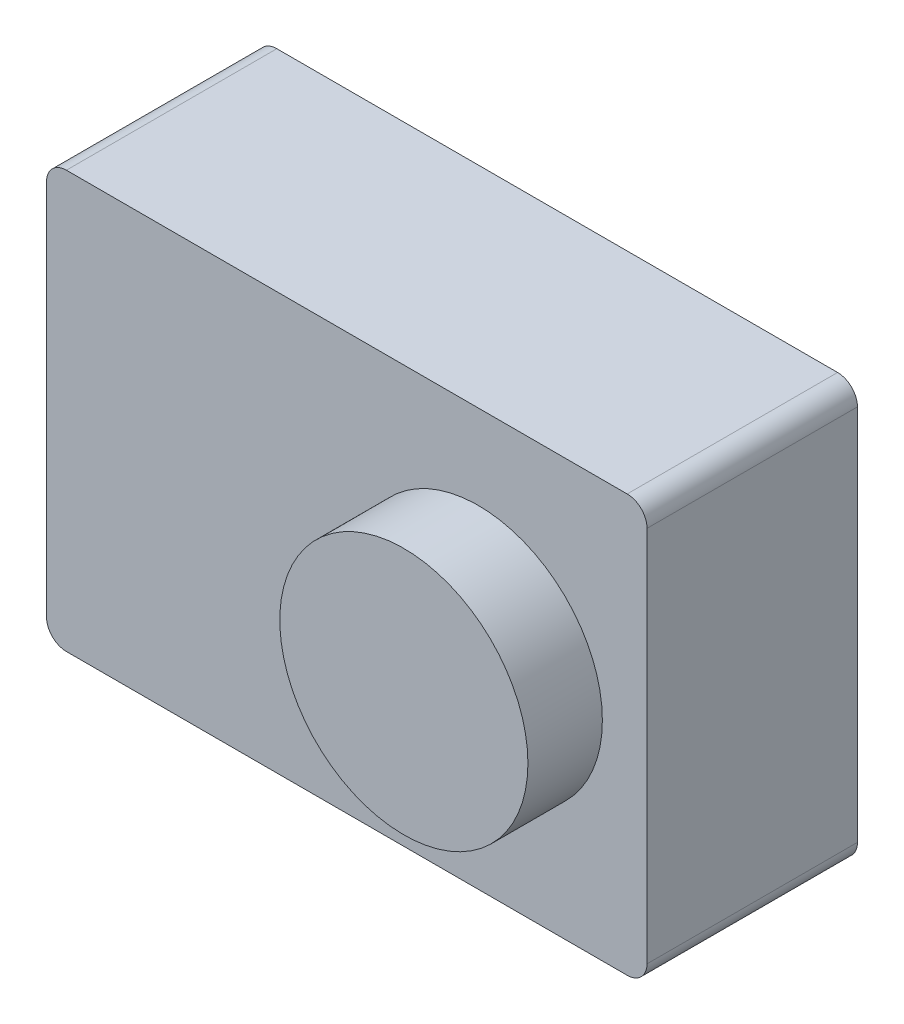
ISO-10303-21;
HEADER;
FILE_DESCRIPTION(('STEP AP214'),'2;1');
FILE_NAME('part.step','',(''),(''),'','','');
FILE_SCHEMA(('AUTOMOTIVE_DESIGN { 1 0 10303 214 1 1 1 1 }'));
ENDSEC;
DATA;
#1=APPLICATION_CONTEXT('core data for automotive mechanical design processes');
#2=APPLICATION_PROTOCOL_DEFINITION('international standard','automotive_design',2000,#1);
#3=PRODUCT_CONTEXT('',#1,'mechanical');
#4=PRODUCT('Part','Part','',(#3));
#5=PRODUCT_RELATED_PRODUCT_CATEGORY('part','',(#4));
#6=PRODUCT_DEFINITION_FORMATION('','',#4);
#7=PRODUCT_DEFINITION_CONTEXT('part definition',#1,'design');
#8=PRODUCT_DEFINITION('design','',#6,#7);
#9=PRODUCT_DEFINITION_SHAPE('','',#8);
#10=(LENGTH_UNIT() NAMED_UNIT(*) SI_UNIT(.MILLI.,.METRE.));
#11=(NAMED_UNIT(*) PLANE_ANGLE_UNIT() SI_UNIT($,.RADIAN.));
#12=(NAMED_UNIT(*) SI_UNIT($,.STERADIAN.) SOLID_ANGLE_UNIT());
#13=UNCERTAINTY_MEASURE_WITH_UNIT(LENGTH_MEASURE(1.E-05),#10,'distance_accuracy_value','');
#14=(GEOMETRIC_REPRESENTATION_CONTEXT(3) GLOBAL_UNCERTAINTY_ASSIGNED_CONTEXT((#13)) GLOBAL_UNIT_ASSIGNED_CONTEXT((#10,
#11,#12)) REPRESENTATION_CONTEXT('',''));
#15=CARTESIAN_POINT('',(0.,0.,0.));
#16=DIRECTION('',(0.,0.,1.));
#17=DIRECTION('',(1.,0.,0.));
#18=AXIS2_PLACEMENT_3D('',#15,#16,#17);
#19=CARTESIAN_POINT('',(-28.25,-19.,21.2));
#20=DIRECTION('',(0.,0.,-1.));
#21=DIRECTION('',(-1.,0.,0.));
#22=AXIS2_PLACEMENT_3D('',#19,#20,#21);
#23=CYLINDRICAL_SURFACE('',#22,2.);
#24=CARTESIAN_POINT('',(-28.25,-19.,0.));
#25=DIRECTION('',(0.,0.,1.));
#26=DIRECTION('',(1.,0.,0.));
#27=AXIS2_PLACEMENT_3D('',#24,#25,#26);
#28=CIRCLE('',#27,2.);
#29=CARTESIAN_POINT('',(-30.25,-19.,0.));
#30=VERTEX_POINT('',#29);
#31=CARTESIAN_POINT('',(-28.25,-21.,0.));
#32=VERTEX_POINT('',#31);
#33=EDGE_CURVE('E129',#30,#32,#28,.T.);
#34=ORIENTED_EDGE('',*,*,#33,.T.);
#35=DIRECTION('',(0.,0.,-1.));
#36=VECTOR('',#35,1.);
#37=CARTESIAN_POINT('',(-28.25,-21.,21.2));
#38=LINE('',#37,#36);
#39=CARTESIAN_POINT('',(-28.25,-21.,21.2));
#40=VERTEX_POINT('',#39);
#41=EDGE_CURVE('E11',#40,#32,#38,.T.);
#42=ORIENTED_EDGE('',*,*,#41,.F.);
#43=CARTESIAN_POINT('',(-28.25,-19.,21.2));
#44=DIRECTION('',(0.,0.,1.));
#45=DIRECTION('',(1.,0.,0.));
#46=AXIS2_PLACEMENT_3D('',#43,#44,#45);
#47=CIRCLE('',#46,2.);
#48=CARTESIAN_POINT('',(-30.25,-19.,21.2));
#49=VERTEX_POINT('',#48);
#50=EDGE_CURVE('E144',#49,#40,#47,.T.);
#51=ORIENTED_EDGE('',*,*,#50,.F.);
#52=DIRECTION('',(0.,0.,-1.));
#53=VECTOR('',#52,1.);
#54=CARTESIAN_POINT('',(-30.25,-19.,21.2));
#55=LINE('',#54,#53);
#56=EDGE_CURVE('E125',#49,#30,#55,.T.);
#57=ORIENTED_EDGE('',*,*,#56,.T.);
#58=EDGE_LOOP('',(#34,#42,#51,#57));
#59=FACE_BOUND('',#58,.T.);
#60=ADVANCED_FACE('F33',(#59),#23,.T.);
#61=CARTESIAN_POINT('',(-28.25,-21.,21.2));
#62=DIRECTION('',(0.,1.,0.));
#63=DIRECTION('',(0.,0.,1.));
#64=AXIS2_PLACEMENT_3D('',#61,#62,#63);
#65=PLANE('',#64);
#66=CARTESIAN_POINT('',(13.25,-21.,10.));
#67=DIRECTION('',(0.,-1.,0.));
#68=DIRECTION('',(0.,0.,-1.));
#69=AXIS2_PLACEMENT_3D('',#66,#67,#68);
#70=CIRCLE('',#69,3.);
#71=CARTESIAN_POINT('',(13.25,-21.,7.));
#72=VERTEX_POINT('',#71);
#73=EDGE_CURVE('E183',#72,#72,#70,.T.);
#74=ORIENTED_EDGE('',*,*,#73,.F.);
#75=EDGE_LOOP('',(#74));
#76=FACE_BOUND('',#75,.T.);
#77=DIRECTION('',(1.,0.,0.));
#78=VECTOR('',#77,1.);
#79=CARTESIAN_POINT('',(-28.25,-21.,0.));
#80=LINE('',#79,#78);
#81=CARTESIAN_POINT('',(28.25,-21.,0.));
#82=VERTEX_POINT('',#81);
#83=EDGE_CURVE('E132',#32,#82,#80,.T.);
#84=ORIENTED_EDGE('',*,*,#83,.T.);
#85=DIRECTION('',(0.,0.,-1.));
#86=VECTOR('',#85,1.);
#87=CARTESIAN_POINT('',(28.25,-21.,21.2));
#88=LINE('',#87,#86);
#89=CARTESIAN_POINT('',(28.25,-21.,21.2));
#90=VERTEX_POINT('',#89);
#91=EDGE_CURVE('E41',#90,#82,#88,.T.);
#92=ORIENTED_EDGE('',*,*,#91,.F.);
#93=DIRECTION('',(1.,0.,0.));
#94=VECTOR('',#93,1.);
#95=CARTESIAN_POINT('',(-28.25,-21.,21.2));
#96=LINE('',#95,#94);
#97=EDGE_CURVE('E92',#40,#90,#96,.T.);
#98=ORIENTED_EDGE('',*,*,#97,.F.);
#99=ORIENTED_EDGE('',*,*,#41,.T.);
#100=EDGE_LOOP('',(#84,#92,#98,#99));
#101=FACE_BOUND('',#100,.T.);
#102=ADVANCED_FACE('F198',(#76,#101),#65,.F.);
#103=CARTESIAN_POINT('',(28.25,-19.,21.2));
#104=DIRECTION('',(0.,0.,-1.));
#105=DIRECTION('',(-1.,0.,0.));
#106=AXIS2_PLACEMENT_3D('',#103,#104,#105);
#107=CYLINDRICAL_SURFACE('',#106,2.);
#108=CARTESIAN_POINT('',(28.25,-19.,0.));
#109=DIRECTION('',(0.,0.,1.));
#110=DIRECTION('',(1.,0.,0.));
#111=AXIS2_PLACEMENT_3D('',#108,#109,#110);
#112=CIRCLE('',#111,2.);
#113=CARTESIAN_POINT('',(30.25,-19.,0.));
#114=VERTEX_POINT('',#113);
#115=EDGE_CURVE('E135',#82,#114,#112,.T.);
#116=ORIENTED_EDGE('',*,*,#115,.T.);
#117=DIRECTION('',(0.,0.,-1.));
#118=VECTOR('',#117,1.);
#119=CARTESIAN_POINT('',(30.25,-19.,21.2));
#120=LINE('',#119,#118);
#121=CARTESIAN_POINT('',(30.25,-19.,21.2));
#122=VERTEX_POINT('',#121);
#123=EDGE_CURVE('E151',#122,#114,#120,.T.);
#124=ORIENTED_EDGE('',*,*,#123,.F.);
#125=CARTESIAN_POINT('',(28.25,-19.,21.2));
#126=DIRECTION('',(0.,0.,1.));
#127=DIRECTION('',(1.,0.,0.));
#128=AXIS2_PLACEMENT_3D('',#125,#126,#127);
#129=CIRCLE('',#128,2.);
#130=EDGE_CURVE('E159',#90,#122,#129,.T.);
#131=ORIENTED_EDGE('',*,*,#130,.F.);
#132=ORIENTED_EDGE('',*,*,#91,.T.);
#133=EDGE_LOOP('',(#116,#124,#131,#132));
#134=FACE_BOUND('',#133,.T.);
#135=ADVANCED_FACE('F157',(#134),#107,.T.);
#136=CARTESIAN_POINT('',(30.25,-19.,21.2));
#137=DIRECTION('',(-1.,0.,0.));
#138=DIRECTION('',(0.,0.,1.));
#139=AXIS2_PLACEMENT_3D('',#136,#137,#138);
#140=PLANE('',#139);
#141=DIRECTION('',(0.,1.,0.));
#142=VECTOR('',#141,1.);
#143=CARTESIAN_POINT('',(30.25,-19.,0.));
#144=LINE('',#143,#142);
#145=CARTESIAN_POINT('',(30.25,19.,0.));
#146=VERTEX_POINT('',#145);
#147=EDGE_CURVE('E137',#114,#146,#144,.T.);
#148=ORIENTED_EDGE('',*,*,#147,.T.);
#149=DIRECTION('',(0.,0.,-1.));
#150=VECTOR('',#149,1.);
#151=CARTESIAN_POINT('',(30.25,19.,21.2));
#152=LINE('',#151,#150);
#153=CARTESIAN_POINT('',(30.25,19.,21.2));
#154=VERTEX_POINT('',#153);
#155=EDGE_CURVE('E148',#154,#146,#152,.T.);
#156=ORIENTED_EDGE('',*,*,#155,.F.);
#157=DIRECTION('',(0.,1.,0.));
#158=VECTOR('',#157,1.);
#159=CARTESIAN_POINT('',(30.25,-19.,21.2));
#160=LINE('',#159,#158);
#161=EDGE_CURVE('E171',#122,#154,#160,.T.);
#162=ORIENTED_EDGE('',*,*,#161,.F.);
#163=ORIENTED_EDGE('',*,*,#123,.T.);
#164=EDGE_LOOP('',(#148,#156,#162,#163));
#165=FACE_BOUND('',#164,.T.);
#166=ADVANCED_FACE('F167',(#165),#140,.F.);
#167=CARTESIAN_POINT('',(28.25,19.,21.2));
#168=DIRECTION('',(0.,0.,-1.));
#169=DIRECTION('',(-1.,0.,0.));
#170=AXIS2_PLACEMENT_3D('',#167,#168,#169);
#171=CYLINDRICAL_SURFACE('',#170,2.);
#172=CARTESIAN_POINT('',(28.25,19.,0.));
#173=DIRECTION('',(0.,0.,1.));
#174=DIRECTION('',(1.,0.,0.));
#175=AXIS2_PLACEMENT_3D('',#172,#173,#174);
#176=CIRCLE('',#175,2.);
#177=CARTESIAN_POINT('',(28.25,21.,0.));
#178=VERTEX_POINT('',#177);
#179=EDGE_CURVE('E139',#146,#178,#176,.T.);
#180=ORIENTED_EDGE('',*,*,#179,.T.);
#181=DIRECTION('',(0.,0.,-1.));
#182=VECTOR('',#181,1.);
#183=CARTESIAN_POINT('',(28.25,21.,21.2));
#184=LINE('',#183,#182);
#185=CARTESIAN_POINT('',(28.25,21.,21.2));
#186=VERTEX_POINT('',#185);
#187=EDGE_CURVE('E120',#186,#178,#184,.T.);
#188=ORIENTED_EDGE('',*,*,#187,.F.);
#189=CARTESIAN_POINT('',(28.25,19.,21.2));
#190=DIRECTION('',(0.,0.,1.));
#191=DIRECTION('',(1.,0.,0.));
#192=AXIS2_PLACEMENT_3D('',#189,#190,#191);
#193=CIRCLE('',#192,2.);
#194=EDGE_CURVE('E111',#154,#186,#193,.T.);
#195=ORIENTED_EDGE('',*,*,#194,.F.);
#196=ORIENTED_EDGE('',*,*,#155,.T.);
#197=EDGE_LOOP('',(#180,#188,#195,#196));
#198=FACE_BOUND('',#197,.T.);
#199=ADVANCED_FACE('F170',(#198),#171,.T.);
#200=CARTESIAN_POINT('',(-28.25,21.,21.2));
#201=DIRECTION('',(0.,-1.,0.));
#202=DIRECTION('',(0.,0.,-1.));
#203=AXIS2_PLACEMENT_3D('',#200,#201,#202);
#204=PLANE('',#203);
#205=DIRECTION('',(-1.,0.,0.));
#206=VECTOR('',#205,1.);
#207=CARTESIAN_POINT('',(-28.25,21.,0.));
#208=LINE('',#207,#206);
#209=CARTESIAN_POINT('',(-28.25,21.,0.));
#210=VERTEX_POINT('',#209);
#211=EDGE_CURVE('E119',#178,#210,#208,.T.);
#212=ORIENTED_EDGE('',*,*,#211,.T.);
#213=DIRECTION('',(0.,0.,-1.));
#214=VECTOR('',#213,1.);
#215=CARTESIAN_POINT('',(-28.25,21.,21.2));
#216=LINE('',#215,#214);
#217=CARTESIAN_POINT('',(-28.25,21.,21.2));
#218=VERTEX_POINT('',#217);
#219=EDGE_CURVE('E116',#218,#210,#216,.T.);
#220=ORIENTED_EDGE('',*,*,#219,.F.);
#221=DIRECTION('',(-1.,0.,0.));
#222=VECTOR('',#221,1.);
#223=CARTESIAN_POINT('',(-28.25,21.,21.2));
#224=LINE('',#223,#222);
#225=EDGE_CURVE('E105',#186,#218,#224,.T.);
#226=ORIENTED_EDGE('',*,*,#225,.F.);
#227=ORIENTED_EDGE('',*,*,#187,.T.);
#228=EDGE_LOOP('',(#212,#220,#226,#227));
#229=FACE_BOUND('',#228,.T.);
#230=ADVANCED_FACE('F117',(#229),#204,.F.);
#231=CARTESIAN_POINT('',(-28.25,19.,21.2));
#232=DIRECTION('',(0.,0.,-1.));
#233=DIRECTION('',(-1.,0.,0.));
#234=AXIS2_PLACEMENT_3D('',#231,#232,#233);
#235=CYLINDRICAL_SURFACE('',#234,2.);
#236=CARTESIAN_POINT('',(-28.25,19.,0.));
#237=DIRECTION('',(0.,0.,1.));
#238=DIRECTION('',(1.,0.,0.));
#239=AXIS2_PLACEMENT_3D('',#236,#237,#238);
#240=CIRCLE('',#239,2.);
#241=CARTESIAN_POINT('',(-30.25,19.,0.));
#242=VERTEX_POINT('',#241);
#243=EDGE_CURVE('E78',#210,#242,#240,.T.);
#244=ORIENTED_EDGE('',*,*,#243,.T.);
#245=DIRECTION('',(0.,0.,-1.));
#246=VECTOR('',#245,1.);
#247=CARTESIAN_POINT('',(-30.25,19.,21.2));
#248=LINE('',#247,#246);
#249=CARTESIAN_POINT('',(-30.25,19.,21.2));
#250=VERTEX_POINT('',#249);
#251=EDGE_CURVE('E121',#250,#242,#248,.T.);
#252=ORIENTED_EDGE('',*,*,#251,.F.);
#253=CARTESIAN_POINT('',(-28.25,19.,21.2));
#254=DIRECTION('',(0.,0.,1.));
#255=DIRECTION('',(1.,0.,0.));
#256=AXIS2_PLACEMENT_3D('',#253,#254,#255);
#257=CIRCLE('',#256,2.);
#258=EDGE_CURVE('E109',#218,#250,#257,.T.);
#259=ORIENTED_EDGE('',*,*,#258,.F.);
#260=ORIENTED_EDGE('',*,*,#219,.T.);
#261=EDGE_LOOP('',(#244,#252,#259,#260));
#262=FACE_BOUND('',#261,.T.);
#263=ADVANCED_FACE('F123',(#262),#235,.T.);
#264=CARTESIAN_POINT('',(-30.25,-19.,21.2));
#265=DIRECTION('',(1.,0.,0.));
#266=DIRECTION('',(0.,0.,-1.));
#267=AXIS2_PLACEMENT_3D('',#264,#265,#266);
#268=PLANE('',#267);
#269=DIRECTION('',(0.,-1.,0.));
#270=VECTOR('',#269,1.);
#271=CARTESIAN_POINT('',(-30.25,-19.,0.));
#272=LINE('',#271,#270);
#273=EDGE_CURVE('E84',#242,#30,#272,.T.);
#274=ORIENTED_EDGE('',*,*,#273,.T.);
#275=ORIENTED_EDGE('',*,*,#56,.F.);
#276=DIRECTION('',(0.,-1.,0.));
#277=VECTOR('',#276,1.);
#278=CARTESIAN_POINT('',(-30.25,-19.,21.2));
#279=LINE('',#278,#277);
#280=EDGE_CURVE('E49',#250,#49,#279,.T.);
#281=ORIENTED_EDGE('',*,*,#280,.F.);
#282=ORIENTED_EDGE('',*,*,#251,.T.);
#283=EDGE_LOOP('',(#274,#275,#281,#282));
#284=FACE_BOUND('',#283,.T.);
#285=ADVANCED_FACE('F203',(#284),#268,.F.);
#286=CARTESIAN_POINT('',(-28.25,-19.,21.2));
#287=DIRECTION('',(0.,0.,1.));
#288=DIRECTION('',(1.,0.,0.));
#289=AXIS2_PLACEMENT_3D('',#286,#287,#288);
#290=PLANE('',#289);
#291=CARTESIAN_POINT('',(13.25,0.,21.2));
#292=DIRECTION('',(0.,0.,1.));
#293=DIRECTION('',(1.,0.,0.));
#294=AXIS2_PLACEMENT_3D('',#291,#292,#293);
#295=CIRCLE('',#294,12.5);
#296=CARTESIAN_POINT('',(25.75,0.,21.2));
#297=VERTEX_POINT('',#296);
#298=EDGE_CURVE('E177',#297,#297,#295,.T.);
#299=ORIENTED_EDGE('',*,*,#298,.F.);
#300=EDGE_LOOP('',(#299));
#301=FACE_BOUND('',#300,.T.);
#302=ORIENTED_EDGE('',*,*,#50,.T.);
#303=ORIENTED_EDGE('',*,*,#97,.T.);
#304=ORIENTED_EDGE('',*,*,#130,.T.);
#305=ORIENTED_EDGE('',*,*,#161,.T.);
#306=ORIENTED_EDGE('',*,*,#194,.T.);
#307=ORIENTED_EDGE('',*,*,#225,.T.);
#308=ORIENTED_EDGE('',*,*,#258,.T.);
#309=ORIENTED_EDGE('',*,*,#280,.T.);
#310=EDGE_LOOP('',(#302,#303,#304,#305,#306,#307,#308,#309));
#311=FACE_BOUND('',#310,.T.);
#312=ADVANCED_FACE('F107',(#301,#311),#290,.T.);
#313=CARTESIAN_POINT('',(-28.25,-19.,0.));
#314=DIRECTION('',(0.,0.,1.));
#315=DIRECTION('',(1.,0.,0.));
#316=AXIS2_PLACEMENT_3D('',#313,#314,#315);
#317=PLANE('',#316);
#318=ORIENTED_EDGE('',*,*,#33,.F.);
#319=ORIENTED_EDGE('',*,*,#273,.F.);
#320=ORIENTED_EDGE('',*,*,#243,.F.);
#321=ORIENTED_EDGE('',*,*,#211,.F.);
#322=ORIENTED_EDGE('',*,*,#179,.F.);
#323=ORIENTED_EDGE('',*,*,#147,.F.);
#324=ORIENTED_EDGE('',*,*,#115,.F.);
#325=ORIENTED_EDGE('',*,*,#83,.F.);
#326=EDGE_LOOP('',(#318,#319,#320,#321,#322,#323,#324,#325));
#327=FACE_BOUND('',#326,.T.);
#328=ADVANCED_FACE('F163',(#327),#317,.F.);
#329=CARTESIAN_POINT('',(13.25,0.,28.7));
#330=DIRECTION('',(0.,0.,-1.));
#331=DIRECTION('',(-1.,0.,0.));
#332=AXIS2_PLACEMENT_3D('',#329,#330,#331);
#333=CYLINDRICAL_SURFACE('',#332,12.5);
#334=CARTESIAN_POINT('',(13.25,0.,28.7));
#335=DIRECTION('',(0.,0.,1.));
#336=DIRECTION('',(1.,0.,0.));
#337=AXIS2_PLACEMENT_3D('',#334,#335,#336);
#338=CIRCLE('',#337,12.5);
#339=CARTESIAN_POINT('',(25.75,0.,28.7));
#340=VERTEX_POINT('',#339);
#341=EDGE_CURVE('E133',#340,#340,#338,.T.);
#342=ORIENTED_EDGE('',*,*,#341,.F.);
#343=EDGE_LOOP('',(#342));
#344=FACE_BOUND('',#343,.T.);
#345=ORIENTED_EDGE('',*,*,#298,.T.);
#346=EDGE_LOOP('',(#345));
#347=FACE_BOUND('',#346,.T.);
#348=ADVANCED_FACE('F267',(#344,#347),#333,.T.);
#349=CARTESIAN_POINT('',(13.25,0.,28.7));
#350=DIRECTION('',(0.,0.,1.));
#351=DIRECTION('',(1.,0.,0.));
#352=AXIS2_PLACEMENT_3D('',#349,#350,#351);
#353=PLANE('',#352);
#354=ORIENTED_EDGE('',*,*,#341,.T.);
#355=EDGE_LOOP('',(#354));
#356=FACE_BOUND('',#355,.T.);
#357=ADVANCED_FACE('F194',(#356),#353,.T.);
#358=CARTESIAN_POINT('',(13.25,-16.,10.));
#359=DIRECTION('',(0.,-1.,0.));
#360=DIRECTION('',(0.,0.,-1.));
#361=AXIS2_PLACEMENT_3D('',#358,#359,#360);
#362=CYLINDRICAL_SURFACE('',#361,3.);
#363=CARTESIAN_POINT('',(13.25,-16.,10.));
#364=DIRECTION('',(0.,-1.,0.));
#365=DIRECTION('',(0.,0.,-1.));
#366=AXIS2_PLACEMENT_3D('',#363,#364,#365);
#367=CIRCLE('',#366,3.);
#368=CARTESIAN_POINT('',(13.25,-16.,7.));
#369=VERTEX_POINT('',#368);
#370=EDGE_CURVE('E180',#369,#369,#367,.T.);
#371=ORIENTED_EDGE('',*,*,#370,.F.);
#372=EDGE_LOOP('',(#371));
#373=FACE_BOUND('',#372,.T.);
#374=ORIENTED_EDGE('',*,*,#73,.T.);
#375=EDGE_LOOP('',(#374));
#376=FACE_BOUND('',#375,.T.);
#377=ADVANCED_FACE('F191',(#373,#376),#362,.F.);
#378=CARTESIAN_POINT('',(13.25,-16.,10.));
#379=DIRECTION('',(0.,-1.,0.));
#380=DIRECTION('',(0.,0.,-1.));
#381=AXIS2_PLACEMENT_3D('',#378,#379,#380);
#382=PLANE('',#381);
#383=ORIENTED_EDGE('',*,*,#370,.T.);
#384=EDGE_LOOP('',(#383));
#385=FACE_BOUND('',#384,.T.);
#386=ADVANCED_FACE('F189',(#385),#382,.T.);
#387=CLOSED_SHELL('',(#60,#102,#135,#166,#199,#230,#263,#285,#312,#328,#348,#357,#377,#386));
#388=MANIFOLD_SOLID_BREP('B2',#387);
#389=ADVANCED_BREP_SHAPE_REPRESENTATION('',(#18,#388),#14);
#390=SHAPE_DEFINITION_REPRESENTATION(#9,#389);
ENDSEC;
END-ISO-10303-21;
